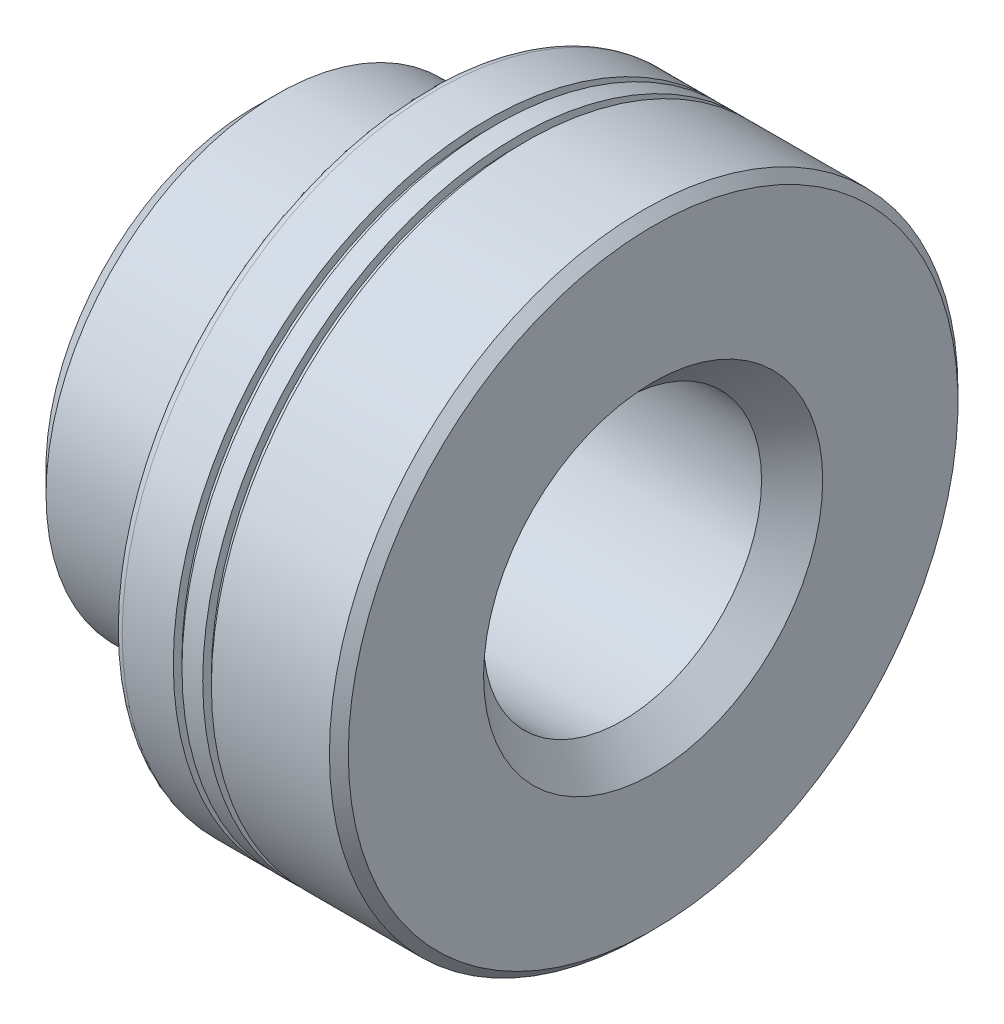
ISO-10303-21;
HEADER;
FILE_DESCRIPTION(('STEP AP214'),'2;1');
FILE_NAME('part.step','',(''),(''),'','','');
FILE_SCHEMA(('AUTOMOTIVE_DESIGN { 1 0 10303 214 1 1 1 1 }'));
ENDSEC;
DATA;
#1=APPLICATION_CONTEXT('core data for automotive mechanical design processes');
#2=APPLICATION_PROTOCOL_DEFINITION('international standard','automotive_design',2000,#1);
#3=PRODUCT_CONTEXT('',#1,'mechanical');
#4=PRODUCT('Part','Part','',(#3));
#5=PRODUCT_RELATED_PRODUCT_CATEGORY('part','',(#4));
#6=PRODUCT_DEFINITION_FORMATION('','',#4);
#7=PRODUCT_DEFINITION_CONTEXT('part definition',#1,'design');
#8=PRODUCT_DEFINITION('design','',#6,#7);
#9=PRODUCT_DEFINITION_SHAPE('','',#8);
#10=(LENGTH_UNIT() NAMED_UNIT(*) SI_UNIT(.MILLI.,.METRE.));
#11=(NAMED_UNIT(*) PLANE_ANGLE_UNIT() SI_UNIT($,.RADIAN.));
#12=(NAMED_UNIT(*) SI_UNIT($,.STERADIAN.) SOLID_ANGLE_UNIT());
#13=UNCERTAINTY_MEASURE_WITH_UNIT(LENGTH_MEASURE(1.E-05),#10,'distance_accuracy_value','');
#14=(GEOMETRIC_REPRESENTATION_CONTEXT(3) GLOBAL_UNCERTAINTY_ASSIGNED_CONTEXT((#13)) GLOBAL_UNIT_ASSIGNED_CONTEXT((#10,
#11,#12)) REPRESENTATION_CONTEXT('',''));
#15=CARTESIAN_POINT('',(0.,0.,0.));
#16=DIRECTION('',(0.,0.,1.));
#17=DIRECTION('',(1.,0.,0.));
#18=AXIS2_PLACEMENT_3D('',#15,#16,#17);
#19=CARTESIAN_POINT('',(1.83945,0.,0.));
#20=DIRECTION('',(-1.,0.,0.));
#21=DIRECTION('',(0.,0.,1.));
#22=AXIS2_PLACEMENT_3D('',#19,#20,#21);
#23=CYLINDRICAL_SURFACE('',#22,2.78);
#24=CARTESIAN_POINT('',(1.6134,0.,0.));
#25=DIRECTION('',(-1.,0.,0.));
#26=DIRECTION('',(0.,0.,1.));
#27=AXIS2_PLACEMENT_3D('',#24,#25,#26);
#28=CIRCLE('',#27,2.78);
#29=CARTESIAN_POINT('',(1.6134,0.,2.78));
#30=VERTEX_POINT('',#29);
#31=EDGE_CURVE('E80',#30,#30,#28,.T.);
#32=ORIENTED_EDGE('',*,*,#31,.F.);
#33=EDGE_LOOP('',(#32));
#34=FACE_BOUND('',#33,.T.);
#35=CARTESIAN_POINT('',(2.0655,0.,0.));
#36=DIRECTION('',(-1.,0.,0.));
#37=DIRECTION('',(0.,0.,1.));
#38=AXIS2_PLACEMENT_3D('',#35,#36,#37);
#39=CIRCLE('',#38,2.78);
#40=CARTESIAN_POINT('',(2.0655,0.,2.78));
#41=VERTEX_POINT('',#40);
#42=EDGE_CURVE('E87',#41,#41,#39,.F.);
#43=ORIENTED_EDGE('',*,*,#42,.F.);
#44=EDGE_LOOP('',(#43));
#45=FACE_BOUND('',#44,.T.);
#46=ADVANCED_FACE('F17',(#34,#45),#23,.T.);
#47=CARTESIAN_POINT('',(2.0655,0.,-2.74175));
#48=DIRECTION('',(1.,0.,0.));
#49=DIRECTION('',(0.,0.,-1.));
#50=AXIS2_PLACEMENT_3D('',#47,#48,#49);
#51=PLANE('',#50);
#52=CARTESIAN_POINT('',(2.0655,0.,0.));
#53=DIRECTION('',(-1.,0.,0.));
#54=DIRECTION('',(0.,0.,1.));
#55=AXIS2_PLACEMENT_3D('',#52,#53,#54);
#56=CIRCLE('',#55,2.7035);
#57=CARTESIAN_POINT('',(2.0655,0.,2.7035));
#58=VERTEX_POINT('',#57);
#59=EDGE_CURVE('E41',#58,#58,#56,.F.);
#60=ORIENTED_EDGE('',*,*,#59,.F.);
#61=EDGE_LOOP('',(#60));
#62=FACE_BOUND('',#61,.T.);
#63=ORIENTED_EDGE('',*,*,#42,.T.);
#64=EDGE_LOOP('',(#63));
#65=FACE_BOUND('',#64,.T.);
#66=ADVANCED_FACE('F73',(#62,#65),#51,.T.);
#67=CARTESIAN_POINT('',(1.6134,0.,0.));
#68=DIRECTION('',(-1.,0.,0.));
#69=DIRECTION('',(0.,0.,1.));
#70=AXIS2_PLACEMENT_3D('',#67,#68,#69);
#71=TOROIDAL_SURFACE('',#70,2.6966,0.0834);
#72=ORIENTED_EDGE('',*,*,#31,.T.);
#73=EDGE_LOOP('',(#72));
#74=FACE_BOUND('',#73,.T.);
#75=CARTESIAN_POINT('',(1.53,0.,0.));
#76=DIRECTION('',(1.,0.,0.));
#77=DIRECTION('',(0.,0.,-1.));
#78=AXIS2_PLACEMENT_3D('',#75,#76,#77);
#79=CIRCLE('',#78,2.6966);
#80=CARTESIAN_POINT('',(1.53,0.,2.6966));
#81=VERTEX_POINT('',#80);
#82=CARTESIAN_POINT('',(1.53,0.,-2.6966));
#83=VERTEX_POINT('',#82);
#84=EDGE_CURVE('E34',#81,#83,#79,.F.);
#85=ORIENTED_EDGE('',*,*,#84,.F.);
#86=CARTESIAN_POINT('',(1.53,0.,0.));
#87=DIRECTION('',(1.,0.,0.));
#88=DIRECTION('',(0.,0.,1.));
#89=AXIS2_PLACEMENT_3D('',#86,#87,#88);
#90=CIRCLE('',#89,2.6966);
#91=EDGE_CURVE('E37',#83,#81,#90,.F.);
#92=ORIENTED_EDGE('',*,*,#91,.F.);
#93=EDGE_LOOP('',(#85,#92));
#94=FACE_BOUND('',#93,.T.);
#95=ADVANCED_FACE('F38',(#74,#94),#71,.T.);
#96=CARTESIAN_POINT('',(2.10375,0.,0.));
#97=DIRECTION('',(-1.,0.,0.));
#98=DIRECTION('',(0.,0.,1.));
#99=AXIS2_PLACEMENT_3D('',#96,#97,#98);
#100=CYLINDRICAL_SURFACE('',#99,2.7035);
#101=ORIENTED_EDGE('',*,*,#59,.T.);
#102=EDGE_LOOP('',(#101));
#103=FACE_BOUND('',#102,.T.);
#104=CARTESIAN_POINT('',(2.142,0.,0.));
#105=DIRECTION('',(-1.,0.,0.));
#106=DIRECTION('',(0.,0.,1.));
#107=AXIS2_PLACEMENT_3D('',#104,#105,#106);
#108=CIRCLE('',#107,2.7035);
#109=CARTESIAN_POINT('',(2.142,0.,2.7035));
#110=VERTEX_POINT('',#109);
#111=EDGE_CURVE('E46',#110,#110,#108,.F.);
#112=ORIENTED_EDGE('',*,*,#111,.F.);
#113=EDGE_LOOP('',(#112));
#114=FACE_BOUND('',#113,.T.);
#115=ADVANCED_FACE('F66',(#103,#114),#100,.T.);
#116=CARTESIAN_POINT('',(1.53,0.,-2.3708));
#117=DIRECTION('',(-1.,0.,0.));
#118=DIRECTION('',(0.,0.,1.));
#119=AXIS2_PLACEMENT_3D('',#116,#117,#118);
#120=PLANE('',#119);
#121=ORIENTED_EDGE('',*,*,#91,.T.);
#122=ORIENTED_EDGE('',*,*,#84,.T.);
#123=EDGE_LOOP('',(#121,#122));
#124=FACE_BOUND('',#123,.T.);
#125=CARTESIAN_POINT('',(1.53,0.,0.));
#126=DIRECTION('',(-1.,0.,0.));
#127=DIRECTION('',(0.,0.,1.));
#128=AXIS2_PLACEMENT_3D('',#125,#126,#127);
#129=CIRCLE('',#128,2.045);
#130=CARTESIAN_POINT('',(1.53,0.,2.045));
#131=VERTEX_POINT('',#130);
#132=EDGE_CURVE('E116',#131,#131,#129,.T.);
#133=ORIENTED_EDGE('',*,*,#132,.F.);
#134=EDGE_LOOP('',(#133));
#135=FACE_BOUND('',#134,.T.);
#136=ADVANCED_FACE('F44',(#124,#135),#120,.T.);
#137=CARTESIAN_POINT('',(2.142,0.,-2.74175));
#138=DIRECTION('',(-1.,0.,0.));
#139=DIRECTION('',(0.,0.,1.));
#140=AXIS2_PLACEMENT_3D('',#137,#138,#139);
#141=PLANE('',#140);
#142=CARTESIAN_POINT('',(2.142,0.,0.));
#143=DIRECTION('',(-1.,0.,0.));
#144=DIRECTION('',(0.,0.,1.));
#145=AXIS2_PLACEMENT_3D('',#142,#143,#144);
#146=CIRCLE('',#145,2.78);
#147=CARTESIAN_POINT('',(2.142,0.,2.78));
#148=VERTEX_POINT('',#147);
#149=EDGE_CURVE('E113',#148,#148,#146,.F.);
#150=ORIENTED_EDGE('',*,*,#149,.F.);
#151=EDGE_LOOP('',(#150));
#152=FACE_BOUND('',#151,.T.);
#153=ORIENTED_EDGE('',*,*,#111,.T.);
#154=EDGE_LOOP('',(#153));
#155=FACE_BOUND('',#154,.T.);
#156=ADVANCED_FACE('F65',(#152,#155),#141,.T.);
#157=CARTESIAN_POINT('',(0.86725,0.,0.));
#158=DIRECTION('',(-1.,0.,0.));
#159=DIRECTION('',(0.,0.,1.));
#160=AXIS2_PLACEMENT_3D('',#157,#158,#159);
#161=CYLINDRICAL_SURFACE('',#160,2.045);
#162=CARTESIAN_POINT('',(0.204499999938434,0.,0.));
#163=DIRECTION('',(1.,0.,0.));
#164=DIRECTION('',(0.,0.,-1.));
#165=AXIS2_PLACEMENT_3D('',#162,#163,#164);
#166=CIRCLE('',#165,2.04500000000962);
#167=CARTESIAN_POINT('',(0.204499999938434,0.,-2.04500000000962));
#168=VERTEX_POINT('',#167);
#169=EDGE_CURVE('E112',#168,#168,#166,.F.);
#170=ORIENTED_EDGE('',*,*,#169,.F.);
#171=EDGE_LOOP('',(#170));
#172=FACE_BOUND('',#171,.T.);
#173=ORIENTED_EDGE('',*,*,#132,.T.);
#174=EDGE_LOOP('',(#173));
#175=FACE_BOUND('',#174,.T.);
#176=ADVANCED_FACE('F184',(#172,#175),#161,.T.);
#177=CARTESIAN_POINT('',(2.2338,0.,0.));
#178=DIRECTION('',(-1.,0.,0.));
#179=DIRECTION('',(0.,0.,1.));
#180=AXIS2_PLACEMENT_3D('',#177,#178,#179);
#181=CYLINDRICAL_SURFACE('',#180,2.78);
#182=ORIENTED_EDGE('',*,*,#149,.T.);
#183=EDGE_LOOP('',(#182));
#184=FACE_BOUND('',#183,.T.);
#185=CARTESIAN_POINT('',(2.3256,0.,0.));
#186=DIRECTION('',(-1.,0.,0.));
#187=DIRECTION('',(0.,0.,1.));
#188=AXIS2_PLACEMENT_3D('',#185,#186,#187);
#189=CIRCLE('',#188,2.78);
#190=CARTESIAN_POINT('',(2.3256,0.,2.78));
#191=VERTEX_POINT('',#190);
#192=EDGE_CURVE('E109',#191,#191,#189,.F.);
#193=ORIENTED_EDGE('',*,*,#192,.F.);
#194=EDGE_LOOP('',(#193));
#195=FACE_BOUND('',#194,.T.);
#196=ADVANCED_FACE('F181',(#184,#195),#181,.T.);
#197=CARTESIAN_POINT('',(0.204499999995278,0.,0.));
#198=DIRECTION('',(1.,0.,0.));
#199=DIRECTION('',(0.,0.,-1.));
#200=AXIS2_PLACEMENT_3D('',#197,#198,#199);
#201=CONICAL_SURFACE('',#200,2.04500000006647,0.785398163397448);
#202=CARTESIAN_POINT('',(5.68432833355365E-11,0.,0.));
#203=DIRECTION('',(1.,0.,0.));
#204=DIRECTION('',(0.,0.,-1.));
#205=AXIS2_PLACEMENT_3D('',#202,#203,#204);
#206=CIRCLE('',#205,1.84050000012803);
#207=CARTESIAN_POINT('',(5.68433931110064E-11,0.,-1.84050000012803));
#208=VERTEX_POINT('',#207);
#209=EDGE_CURVE('E106',#208,#208,#206,.F.);
#210=ORIENTED_EDGE('',*,*,#209,.F.);
#211=EDGE_LOOP('',(#210));
#212=FACE_BOUND('',#211,.T.);
#213=ORIENTED_EDGE('',*,*,#169,.T.);
#214=EDGE_LOOP('',(#213));
#215=FACE_BOUND('',#214,.T.);
#216=ADVANCED_FACE('F177',(#212,#215),#201,.T.);
#217=CARTESIAN_POINT('',(2.3256,0.,-2.74175));
#218=DIRECTION('',(1.,0.,0.));
#219=DIRECTION('',(0.,0.,-1.));
#220=AXIS2_PLACEMENT_3D('',#217,#218,#219);
#221=PLANE('',#220);
#222=CARTESIAN_POINT('',(2.3256,0.,0.));
#223=DIRECTION('',(-1.,0.,0.));
#224=DIRECTION('',(0.,0.,1.));
#225=AXIS2_PLACEMENT_3D('',#222,#223,#224);
#226=CIRCLE('',#225,2.7035);
#227=CARTESIAN_POINT('',(2.3256,0.,2.7035));
#228=VERTEX_POINT('',#227);
#229=EDGE_CURVE('E103',#228,#228,#226,.F.);
#230=ORIENTED_EDGE('',*,*,#229,.F.);
#231=EDGE_LOOP('',(#230));
#232=FACE_BOUND('',#231,.T.);
#233=ORIENTED_EDGE('',*,*,#192,.T.);
#234=EDGE_LOOP('',(#233));
#235=FACE_BOUND('',#234,.T.);
#236=ADVANCED_FACE('F173',(#232,#235),#221,.T.);
#237=CARTESIAN_POINT('',(0.,0.,-0.92025));
#238=DIRECTION('',(-1.,0.,0.));
#239=DIRECTION('',(0.,0.,1.));
#240=AXIS2_PLACEMENT_3D('',#237,#238,#239);
#241=PLANE('',#240);
#242=ORIENTED_EDGE('',*,*,#209,.T.);
#243=EDGE_LOOP('',(#242));
#244=FACE_BOUND('',#243,.T.);
#245=CARTESIAN_POINT('',(0.,0.,0.));
#246=DIRECTION('',(-1.,0.,0.));
#247=DIRECTION('',(0.,0.,1.));
#248=AXIS2_PLACEMENT_3D('',#245,#246,#247);
#249=CIRCLE('',#248,1.50000000002137);
#250=CARTESIAN_POINT('',(0.,0.,1.50000000002137));
#251=VERTEX_POINT('',#250);
#252=EDGE_CURVE('E100',#251,#251,#249,.F.);
#253=ORIENTED_EDGE('',*,*,#252,.T.);
#254=EDGE_LOOP('',(#253));
#255=FACE_BOUND('',#254,.T.);
#256=ADVANCED_FACE('F169',(#244,#255),#241,.T.);
#257=CARTESIAN_POINT('',(2.36385,0.,0.));
#258=DIRECTION('',(-1.,0.,0.));
#259=DIRECTION('',(0.,0.,1.));
#260=AXIS2_PLACEMENT_3D('',#257,#258,#259);
#261=CYLINDRICAL_SURFACE('',#260,2.7035);
#262=ORIENTED_EDGE('',*,*,#229,.T.);
#263=EDGE_LOOP('',(#262));
#264=FACE_BOUND('',#263,.T.);
#265=CARTESIAN_POINT('',(2.4021,0.,0.));
#266=DIRECTION('',(-1.,0.,0.));
#267=DIRECTION('',(0.,0.,1.));
#268=AXIS2_PLACEMENT_3D('',#265,#266,#267);
#269=CIRCLE('',#268,2.7035);
#270=CARTESIAN_POINT('',(2.4021,0.,2.7035));
#271=VERTEX_POINT('',#270);
#272=EDGE_CURVE('E97',#271,#271,#269,.F.);
#273=ORIENTED_EDGE('',*,*,#272,.F.);
#274=EDGE_LOOP('',(#273));
#275=FACE_BOUND('',#274,.T.);
#276=ADVANCED_FACE('F165',(#264,#275),#261,.T.);
#277=CARTESIAN_POINT('',(0.,0.,0.));
#278=DIRECTION('',(-1.,0.,0.));
#279=DIRECTION('',(0.,0.,1.));
#280=AXIS2_PLACEMENT_3D('',#277,#278,#279);
#281=CONICAL_SURFACE('',#280,1.50000000002137,0.785398163397448);
#282=ORIENTED_EDGE('',*,*,#252,.F.);
#283=EDGE_LOOP('',(#282));
#284=FACE_BOUND('',#283,.T.);
#285=CARTESIAN_POINT('',(0.2705,0.,0.));
#286=DIRECTION('',(-1.,0.,0.));
#287=DIRECTION('',(0.,0.,1.));
#288=AXIS2_PLACEMENT_3D('',#285,#286,#287);
#289=CIRCLE('',#288,1.2295);
#290=CARTESIAN_POINT('',(0.2705,0.,1.2295));
#291=VERTEX_POINT('',#290);
#292=EDGE_CURVE('E96',#291,#291,#289,.F.);
#293=ORIENTED_EDGE('',*,*,#292,.T.);
#294=EDGE_LOOP('',(#293));
#295=FACE_BOUND('',#294,.T.);
#296=ADVANCED_FACE('F161',(#284,#295),#281,.F.);
#297=CARTESIAN_POINT('',(2.4021,0.,-2.74175));
#298=DIRECTION('',(-1.,0.,0.));
#299=DIRECTION('',(0.,0.,1.));
#300=AXIS2_PLACEMENT_3D('',#297,#298,#299);
#301=PLANE('',#300);
#302=CARTESIAN_POINT('',(2.4021,0.,0.));
#303=DIRECTION('',(-1.,0.,0.));
#304=DIRECTION('',(0.,0.,1.));
#305=AXIS2_PLACEMENT_3D('',#302,#303,#304);
#306=CIRCLE('',#305,2.78);
#307=CARTESIAN_POINT('',(2.4021,0.,2.78));
#308=VERTEX_POINT('',#307);
#309=EDGE_CURVE('E92',#308,#308,#306,.F.);
#310=ORIENTED_EDGE('',*,*,#309,.F.);
#311=EDGE_LOOP('',(#310));
#312=FACE_BOUND('',#311,.T.);
#313=ORIENTED_EDGE('',*,*,#272,.T.);
#314=EDGE_LOOP('',(#313));
#315=FACE_BOUND('',#314,.T.);
#316=ADVANCED_FACE('F157',(#312,#315),#301,.T.);
#317=CARTESIAN_POINT('',(1.765,0.,0.));
#318=DIRECTION('',(-1.,0.,0.));
#319=DIRECTION('',(0.,0.,1.));
#320=AXIS2_PLACEMENT_3D('',#317,#318,#319);
#321=CYLINDRICAL_SURFACE('',#320,1.2295);
#322=ORIENTED_EDGE('',*,*,#292,.F.);
#323=EDGE_LOOP('',(#322));
#324=FACE_BOUND('',#323,.T.);
#325=CARTESIAN_POINT('',(3.25949999995601,0.,0.));
#326=DIRECTION('',(1.,0.,0.));
#327=DIRECTION('',(0.,0.,-1.));
#328=AXIS2_PLACEMENT_3D('',#325,#326,#327);
#329=CIRCLE('',#328,1.2295000000222);
#330=CARTESIAN_POINT('',(3.25949999995601,0.,-1.2295000000222));
#331=VERTEX_POINT('',#330);
#332=EDGE_CURVE('E95',#331,#331,#329,.T.);
#333=ORIENTED_EDGE('',*,*,#332,.T.);
#334=EDGE_LOOP('',(#333));
#335=FACE_BOUND('',#334,.T.);
#336=ADVANCED_FACE('F153',(#324,#335),#321,.F.);
#337=CARTESIAN_POINT('',(2.92435,0.,0.));
#338=DIRECTION('',(-1.,0.,0.));
#339=DIRECTION('',(0.,0.,1.));
#340=AXIS2_PLACEMENT_3D('',#337,#338,#339);
#341=CYLINDRICAL_SURFACE('',#340,2.78);
#342=ORIENTED_EDGE('',*,*,#309,.T.);
#343=EDGE_LOOP('',(#342));
#344=FACE_BOUND('',#343,.T.);
#345=CARTESIAN_POINT('',(3.44660000001795,0.,0.));
#346=DIRECTION('',(-1.,0.,0.));
#347=DIRECTION('',(0.,0.,-1.));
#348=AXIS2_PLACEMENT_3D('',#345,#346,#347);
#349=CIRCLE('',#348,2.78000000002976);
#350=CARTESIAN_POINT('',(3.44660000001795,0.,-2.78000000002976));
#351=VERTEX_POINT('',#350);
#352=EDGE_CURVE('E91',#351,#351,#349,.F.);
#353=ORIENTED_EDGE('',*,*,#352,.F.);
#354=EDGE_LOOP('',(#353));
#355=FACE_BOUND('',#354,.T.);
#356=ADVANCED_FACE('F149',(#344,#355),#341,.T.);
#357=CARTESIAN_POINT('',(3.52999999989834,0.,0.));
#358=DIRECTION('',(1.,0.,0.));
#359=DIRECTION('',(0.,1.,0.));
#360=AXIS2_PLACEMENT_3D('',#357,#358,#359);
#361=CONICAL_SURFACE('',#360,1.49999999990769,0.785398163397448);
#362=ORIENTED_EDGE('',*,*,#332,.F.);
#363=EDGE_LOOP('',(#362));
#364=FACE_BOUND('',#363,.T.);
#365=CARTESIAN_POINT('',(3.53000000001202,0.,0.));
#366=DIRECTION('',(1.,0.,0.));
#367=DIRECTION('',(0.,1.,0.));
#368=AXIS2_PLACEMENT_3D('',#365,#366,#367);
#369=CIRCLE('',#368,1.50000000002137);
#370=CARTESIAN_POINT('',(3.53000000001202,1.50000000002137,0.));
#371=VERTEX_POINT('',#370);
#372=EDGE_CURVE('E27',#371,#371,#369,.F.);
#373=ORIENTED_EDGE('',*,*,#372,.F.);
#374=EDGE_LOOP('',(#373));
#375=FACE_BOUND('',#374,.T.);
#376=ADVANCED_FACE('F142',(#364,#375),#361,.F.);
#377=CARTESIAN_POINT('',(3.44659999996111,0.,0.));
#378=DIRECTION('',(-1.,0.,0.));
#379=DIRECTION('',(0.,0.,1.));
#380=AXIS2_PLACEMENT_3D('',#377,#378,#379);
#381=CONICAL_SURFACE('',#380,2.7800000000866,0.785398163397446);
#382=ORIENTED_EDGE('',*,*,#352,.T.);
#383=EDGE_LOOP('',(#382));
#384=FACE_BOUND('',#383,.T.);
#385=CARTESIAN_POINT('',(3.53000000006887,0.,0.));
#386=DIRECTION('',(-1.,0.,0.));
#387=DIRECTION('',(0.,0.,1.));
#388=AXIS2_PLACEMENT_3D('',#385,#386,#387);
#389=CIRCLE('',#388,2.69659999997884);
#390=CARTESIAN_POINT('',(3.53000000006887,0.,2.69659999997884));
#391=VERTEX_POINT('',#390);
#392=EDGE_CURVE('E11',#391,#391,#389,.F.);
#393=ORIENTED_EDGE('',*,*,#392,.F.);
#394=EDGE_LOOP('',(#393));
#395=FACE_BOUND('',#394,.T.);
#396=ADVANCED_FACE('F136',(#384,#395),#381,.T.);
#397=CARTESIAN_POINT('',(3.53,0.,-1.3483));
#398=DIRECTION('',(1.,0.,0.));
#399=DIRECTION('',(0.,0.,-1.));
#400=AXIS2_PLACEMENT_3D('',#397,#398,#399);
#401=PLANE('',#400);
#402=ORIENTED_EDGE('',*,*,#392,.T.);
#403=EDGE_LOOP('',(#402));
#404=FACE_BOUND('',#403,.T.);
#405=ORIENTED_EDGE('',*,*,#372,.T.);
#406=EDGE_LOOP('',(#405));
#407=FACE_BOUND('',#406,.T.);
#408=ADVANCED_FACE('F134',(#404,#407),#401,.T.);
#409=CLOSED_SHELL('',(#46,#66,#95,#115,#136,#156,#176,#196,#216,#236,#256,#276,#296,#316,#336,
#356,#376,#396,#408));
#410=MANIFOLD_SOLID_BREP('B1',#409);
#411=ADVANCED_BREP_SHAPE_REPRESENTATION('',(#18,#410),#14);
#412=SHAPE_DEFINITION_REPRESENTATION(#9,#411);
ENDSEC;
END-ISO-10303-21;
